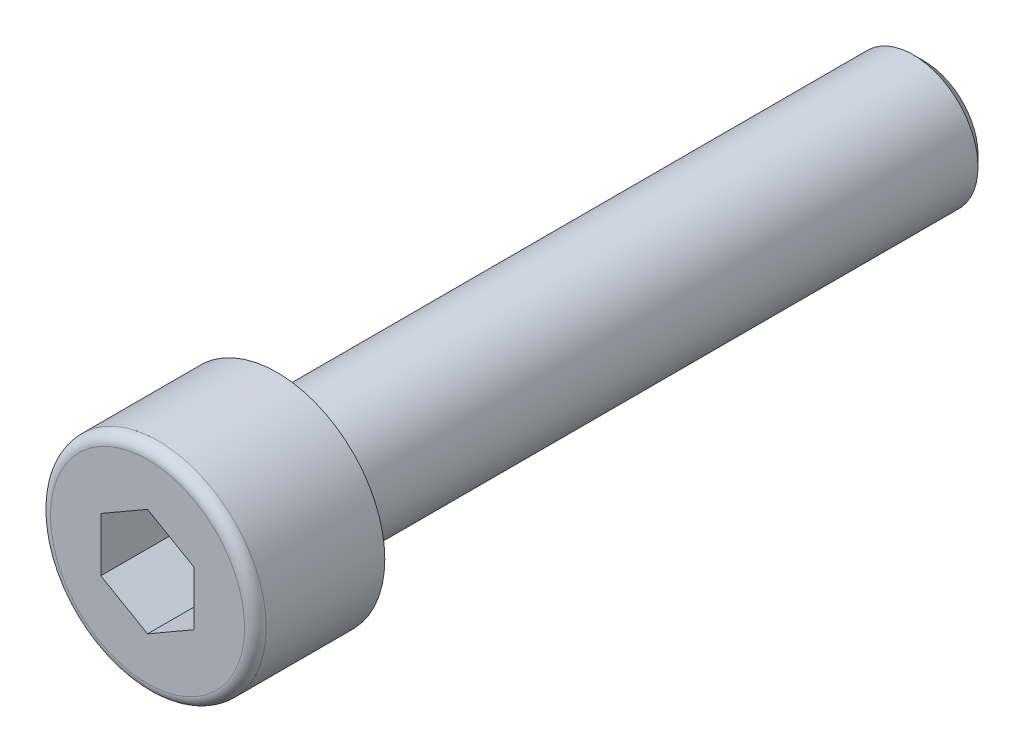
ISO-10303-21;
HEADER;
FILE_DESCRIPTION(('STEP AP214'),'2;1');
FILE_NAME('part.step','',(''),(''),'','','');
FILE_SCHEMA(('AUTOMOTIVE_DESIGN { 1 0 10303 214 1 1 1 1 }'));
ENDSEC;
DATA;
#1=APPLICATION_CONTEXT('core data for automotive mechanical design processes');
#2=APPLICATION_PROTOCOL_DEFINITION('international standard','automotive_design',2000,#1);
#3=PRODUCT_CONTEXT('',#1,'mechanical');
#4=PRODUCT('Part','Part','',(#3));
#5=PRODUCT_RELATED_PRODUCT_CATEGORY('part','',(#4));
#6=PRODUCT_DEFINITION_FORMATION('','',#4);
#7=PRODUCT_DEFINITION_CONTEXT('part definition',#1,'design');
#8=PRODUCT_DEFINITION('design','',#6,#7);
#9=PRODUCT_DEFINITION_SHAPE('','',#8);
#10=(LENGTH_UNIT() NAMED_UNIT(*) SI_UNIT(.MILLI.,.METRE.));
#11=(NAMED_UNIT(*) PLANE_ANGLE_UNIT() SI_UNIT($,.RADIAN.));
#12=(NAMED_UNIT(*) SI_UNIT($,.STERADIAN.) SOLID_ANGLE_UNIT());
#13=UNCERTAINTY_MEASURE_WITH_UNIT(LENGTH_MEASURE(1.E-05),#10,'distance_accuracy_value','');
#14=(GEOMETRIC_REPRESENTATION_CONTEXT(3) GLOBAL_UNCERTAINTY_ASSIGNED_CONTEXT((#13)) GLOBAL_UNIT_ASSIGNED_CONTEXT((#10,
#11,#12)) REPRESENTATION_CONTEXT('',''));
#15=CARTESIAN_POINT('',(0.,0.,0.));
#16=DIRECTION('',(0.,0.,1.));
#17=DIRECTION('',(1.,0.,0.));
#18=AXIS2_PLACEMENT_3D('',#15,#16,#17);
#19=CARTESIAN_POINT('',(0.,0.,30.));
#20=DIRECTION('',(0.,0.,-1.));
#21=DIRECTION('',(-1.,0.,0.));
#22=AXIS2_PLACEMENT_3D('',#19,#20,#21);
#23=CYLINDRICAL_SURFACE('',#22,3.);
#24=CARTESIAN_POINT('',(0.,0.,0.500000000000007));
#25=DIRECTION('',(0.,0.,1.));
#26=DIRECTION('',(1.,0.,0.));
#27=AXIS2_PLACEMENT_3D('',#24,#25,#26);
#28=CIRCLE('',#27,3.);
#29=CARTESIAN_POINT('',(3.,0.,0.500000000000007));
#30=VERTEX_POINT('',#29);
#31=EDGE_CURVE('E42',#30,#30,#28,.T.);
#32=ORIENTED_EDGE('',*,*,#31,.T.);
#33=EDGE_LOOP('',(#32));
#34=FACE_BOUND('',#33,.T.);
#35=CARTESIAN_POINT('',(0.,0.,30.));
#36=DIRECTION('',(0.,0.,1.));
#37=DIRECTION('',(1.,0.,0.));
#38=AXIS2_PLACEMENT_3D('',#35,#36,#37);
#39=CIRCLE('',#38,3.);
#40=CARTESIAN_POINT('',(3.,0.,30.));
#41=VERTEX_POINT('',#40);
#42=EDGE_CURVE('E145',#41,#41,#39,.T.);
#43=ORIENTED_EDGE('',*,*,#42,.F.);
#44=EDGE_LOOP('',(#43));
#45=FACE_BOUND('',#44,.T.);
#46=ADVANCED_FACE('F35',(#34,#45),#23,.T.);
#47=CARTESIAN_POINT('',(0.,0.,0.));
#48=DIRECTION('',(0.,0.,1.));
#49=DIRECTION('',(1.,0.,0.));
#50=AXIS2_PLACEMENT_3D('',#47,#48,#49);
#51=PLANE('',#50);
#52=CARTESIAN_POINT('',(0.,0.,0.));
#53=DIRECTION('',(0.,0.,1.));
#54=DIRECTION('',(1.,0.,0.));
#55=AXIS2_PLACEMENT_3D('',#52,#53,#54);
#56=CIRCLE('',#55,2.5);
#57=CARTESIAN_POINT('',(2.5,0.,0.));
#58=VERTEX_POINT('',#57);
#59=EDGE_CURVE('E11',#58,#58,#56,.F.);
#60=ORIENTED_EDGE('',*,*,#59,.T.);
#61=EDGE_LOOP('',(#60));
#62=FACE_BOUND('',#61,.T.);
#63=ADVANCED_FACE('F171',(#62),#51,.F.);
#64=CARTESIAN_POINT('',(0.,0.,30.));
#65=DIRECTION('',(0.,0.,1.));
#66=DIRECTION('',(1.,0.,0.));
#67=AXIS2_PLACEMENT_3D('',#64,#65,#66);
#68=PLANE('',#67);
#69=CARTESIAN_POINT('',(0.,0.,30.));
#70=DIRECTION('',(0.,0.,1.));
#71=DIRECTION('',(1.,0.,0.));
#72=AXIS2_PLACEMENT_3D('',#69,#70,#71);
#73=CIRCLE('',#72,5.);
#74=CARTESIAN_POINT('',(5.,0.,30.));
#75=VERTEX_POINT('',#74);
#76=EDGE_CURVE('E136',#75,#75,#73,.T.);
#77=ORIENTED_EDGE('',*,*,#76,.F.);
#78=EDGE_LOOP('',(#77));
#79=FACE_BOUND('',#78,.T.);
#80=ORIENTED_EDGE('',*,*,#42,.T.);
#81=EDGE_LOOP('',(#80));
#82=FACE_BOUND('',#81,.T.);
#83=ADVANCED_FACE('F175',(#79,#82),#68,.F.);
#84=CARTESIAN_POINT('',(0.,0.,36.));
#85=DIRECTION('',(0.,0.,-1.));
#86=DIRECTION('',(-1.,0.,0.));
#87=AXIS2_PLACEMENT_3D('',#84,#85,#86);
#88=CYLINDRICAL_SURFACE('',#87,5.);
#89=CARTESIAN_POINT('',(0.,0.,35.5));
#90=DIRECTION('',(0.,0.,1.));
#91=DIRECTION('',(1.,0.,0.));
#92=AXIS2_PLACEMENT_3D('',#89,#90,#91);
#93=CIRCLE('',#92,5.);
#94=CARTESIAN_POINT('',(5.,0.,35.5));
#95=VERTEX_POINT('',#94);
#96=EDGE_CURVE('E151',#95,#95,#93,.F.);
#97=ORIENTED_EDGE('',*,*,#96,.T.);
#98=EDGE_LOOP('',(#97));
#99=FACE_BOUND('',#98,.T.);
#100=ORIENTED_EDGE('',*,*,#76,.T.);
#101=EDGE_LOOP('',(#100));
#102=FACE_BOUND('',#101,.T.);
#103=ADVANCED_FACE('F180',(#99,#102),#88,.T.);
#104=CARTESIAN_POINT('',(0.,0.,36.));
#105=DIRECTION('',(0.,0.,1.));
#106=DIRECTION('',(1.,0.,0.));
#107=AXIS2_PLACEMENT_3D('',#104,#105,#106);
#108=PLANE('',#107);
#109=CARTESIAN_POINT('',(0.,0.,36.));
#110=DIRECTION('',(0.,0.,1.));
#111=DIRECTION('',(1.,0.,0.));
#112=AXIS2_PLACEMENT_3D('',#109,#110,#111);
#113=CIRCLE('',#112,4.5);
#114=CARTESIAN_POINT('',(4.5,0.,36.));
#115=VERTEX_POINT('',#114);
#116=EDGE_CURVE('E148',#115,#115,#113,.T.);
#117=ORIENTED_EDGE('',*,*,#116,.T.);
#118=EDGE_LOOP('',(#117));
#119=FACE_BOUND('',#118,.T.);
#120=DIRECTION('',(-0.866025403784439,0.5,0.));
#121=VECTOR('',#120,1.);
#122=CARTESIAN_POINT('',(2.1650635094611,1.25,36.));
#123=LINE('',#122,#121);
#124=CARTESIAN_POINT('',(2.1650635094611,1.25,36.));
#125=VERTEX_POINT('',#124);
#126=CARTESIAN_POINT('',(0.,2.5,36.));
#127=VERTEX_POINT('',#126);
#128=EDGE_CURVE('E49',#125,#127,#123,.T.);
#129=ORIENTED_EDGE('',*,*,#128,.F.);
#130=DIRECTION('',(0.,1.,0.));
#131=VECTOR('',#130,1.);
#132=CARTESIAN_POINT('',(2.1650635094611,-1.25,36.));
#133=LINE('',#132,#131);
#134=CARTESIAN_POINT('',(2.1650635094611,-1.25,36.));
#135=VERTEX_POINT('',#134);
#136=EDGE_CURVE('E118',#135,#125,#133,.T.);
#137=ORIENTED_EDGE('',*,*,#136,.F.);
#138=DIRECTION('',(0.866025403784439,0.5,0.));
#139=VECTOR('',#138,1.);
#140=CARTESIAN_POINT('',(0.,-2.5,36.));
#141=LINE('',#140,#139);
#142=CARTESIAN_POINT('',(0.,-2.5,36.));
#143=VERTEX_POINT('',#142);
#144=EDGE_CURVE('E112',#143,#135,#141,.T.);
#145=ORIENTED_EDGE('',*,*,#144,.F.);
#146=DIRECTION('',(0.866025403784439,-0.5,0.));
#147=VECTOR('',#146,1.);
#148=CARTESIAN_POINT('',(-2.1650635094611,-1.25,36.));
#149=LINE('',#148,#147);
#150=CARTESIAN_POINT('',(-2.1650635094611,-1.25,36.));
#151=VERTEX_POINT('',#150);
#152=EDGE_CURVE('E110',#151,#143,#149,.T.);
#153=ORIENTED_EDGE('',*,*,#152,.F.);
#154=DIRECTION('',(0.,-1.,0.));
#155=VECTOR('',#154,1.);
#156=CARTESIAN_POINT('',(-2.1650635094611,1.25,36.));
#157=LINE('',#156,#155);
#158=CARTESIAN_POINT('',(-2.1650635094611,1.25,36.));
#159=VERTEX_POINT('',#158);
#160=EDGE_CURVE('E92',#159,#151,#157,.T.);
#161=ORIENTED_EDGE('',*,*,#160,.F.);
#162=DIRECTION('',(-0.866025403784439,-0.5,0.));
#163=VECTOR('',#162,1.);
#164=CARTESIAN_POINT('',(0.,2.5,36.));
#165=LINE('',#164,#163);
#166=EDGE_CURVE('E103',#127,#159,#165,.T.);
#167=ORIENTED_EDGE('',*,*,#166,.F.);
#168=EDGE_LOOP('',(#129,#137,#145,#153,#161,#167));
#169=FACE_BOUND('',#168,.T.);
#170=ADVANCED_FACE('F107',(#119,#169),#108,.T.);
#171=CARTESIAN_POINT('',(2.1650635094611,1.25,32.5));
#172=DIRECTION('',(0.5,0.866025403784439,0.));
#173=DIRECTION('',(-0.866025403784439,0.5,0.));
#174=AXIS2_PLACEMENT_3D('',#171,#172,#173);
#175=PLANE('',#174);
#176=ORIENTED_EDGE('',*,*,#128,.T.);
#177=DIRECTION('',(0.,0.,1.));
#178=VECTOR('',#177,1.);
#179=CARTESIAN_POINT('',(0.,2.5,32.5));
#180=LINE('',#179,#178);
#181=CARTESIAN_POINT('',(0.,2.5,32.5));
#182=VERTEX_POINT('',#181);
#183=EDGE_CURVE('E100',#182,#127,#180,.T.);
#184=ORIENTED_EDGE('',*,*,#183,.F.);
#185=DIRECTION('',(-0.866025403784439,0.5,0.));
#186=VECTOR('',#185,1.);
#187=CARTESIAN_POINT('',(2.1650635094611,1.25,32.5));
#188=LINE('',#187,#186);
#189=CARTESIAN_POINT('',(2.1650635094611,1.25,32.5));
#190=VERTEX_POINT('',#189);
#191=EDGE_CURVE('E120',#190,#182,#188,.T.);
#192=ORIENTED_EDGE('',*,*,#191,.F.);
#193=DIRECTION('',(0.,0.,1.));
#194=VECTOR('',#193,1.);
#195=CARTESIAN_POINT('',(2.1650635094611,1.25,32.5));
#196=LINE('',#195,#194);
#197=EDGE_CURVE('E56',#190,#125,#196,.T.);
#198=ORIENTED_EDGE('',*,*,#197,.T.);
#199=EDGE_LOOP('',(#176,#184,#192,#198));
#200=FACE_BOUND('',#199,.T.);
#201=ADVANCED_FACE('F188',(#200),#175,.F.);
#202=CARTESIAN_POINT('',(2.1650635094611,-1.25,32.5));
#203=DIRECTION('',(1.,0.,0.));
#204=DIRECTION('',(0.,1.,0.));
#205=AXIS2_PLACEMENT_3D('',#202,#203,#204);
#206=PLANE('',#205);
#207=ORIENTED_EDGE('',*,*,#136,.T.);
#208=ORIENTED_EDGE('',*,*,#197,.F.);
#209=DIRECTION('',(0.,1.,0.));
#210=VECTOR('',#209,1.);
#211=CARTESIAN_POINT('',(2.1650635094611,-1.25,32.5));
#212=LINE('',#211,#210);
#213=CARTESIAN_POINT('',(2.1650635094611,-1.25,32.5));
#214=VERTEX_POINT('',#213);
#215=EDGE_CURVE('E132',#214,#190,#212,.T.);
#216=ORIENTED_EDGE('',*,*,#215,.F.);
#217=DIRECTION('',(0.,0.,1.));
#218=VECTOR('',#217,1.);
#219=CARTESIAN_POINT('',(2.1650635094611,-1.25,32.5));
#220=LINE('',#219,#218);
#221=EDGE_CURVE('E137',#214,#135,#220,.T.);
#222=ORIENTED_EDGE('',*,*,#221,.T.);
#223=EDGE_LOOP('',(#207,#208,#216,#222));
#224=FACE_BOUND('',#223,.T.);
#225=ADVANCED_FACE('F193',(#224),#206,.F.);
#226=CARTESIAN_POINT('',(0.,-2.5,32.5));
#227=DIRECTION('',(0.5,-0.866025403784439,0.));
#228=DIRECTION('',(0.866025403784439,0.5,0.));
#229=AXIS2_PLACEMENT_3D('',#226,#227,#228);
#230=PLANE('',#229);
#231=ORIENTED_EDGE('',*,*,#144,.T.);
#232=ORIENTED_EDGE('',*,*,#221,.F.);
#233=DIRECTION('',(0.866025403784439,0.5,0.));
#234=VECTOR('',#233,1.);
#235=CARTESIAN_POINT('',(0.,-2.5,32.5));
#236=LINE('',#235,#234);
#237=CARTESIAN_POINT('',(0.,-2.5,32.5));
#238=VERTEX_POINT('',#237);
#239=EDGE_CURVE('E129',#238,#214,#236,.T.);
#240=ORIENTED_EDGE('',*,*,#239,.F.);
#241=DIRECTION('',(0.,0.,1.));
#242=VECTOR('',#241,1.);
#243=CARTESIAN_POINT('',(0.,-2.5,32.5));
#244=LINE('',#243,#242);
#245=EDGE_CURVE('E139',#238,#143,#244,.T.);
#246=ORIENTED_EDGE('',*,*,#245,.T.);
#247=EDGE_LOOP('',(#231,#232,#240,#246));
#248=FACE_BOUND('',#247,.T.);
#249=ADVANCED_FACE('F201',(#248),#230,.F.);
#250=CARTESIAN_POINT('',(-2.1650635094611,-1.25,32.5));
#251=DIRECTION('',(-0.5,-0.866025403784439,0.));
#252=DIRECTION('',(0.866025403784439,-0.5,0.));
#253=AXIS2_PLACEMENT_3D('',#250,#251,#252);
#254=PLANE('',#253);
#255=ORIENTED_EDGE('',*,*,#152,.T.);
#256=ORIENTED_EDGE('',*,*,#245,.F.);
#257=DIRECTION('',(0.866025403784439,-0.5,0.));
#258=VECTOR('',#257,1.);
#259=CARTESIAN_POINT('',(-2.1650635094611,-1.25,32.5));
#260=LINE('',#259,#258);
#261=CARTESIAN_POINT('',(-2.1650635094611,-1.25,32.5));
#262=VERTEX_POINT('',#261);
#263=EDGE_CURVE('E126',#262,#238,#260,.T.);
#264=ORIENTED_EDGE('',*,*,#263,.F.);
#265=DIRECTION('',(0.,0.,1.));
#266=VECTOR('',#265,1.);
#267=CARTESIAN_POINT('',(-2.1650635094611,-1.25,32.5));
#268=LINE('',#267,#266);
#269=EDGE_CURVE('E99',#262,#151,#268,.T.);
#270=ORIENTED_EDGE('',*,*,#269,.T.);
#271=EDGE_LOOP('',(#255,#256,#264,#270));
#272=FACE_BOUND('',#271,.T.);
#273=ADVANCED_FACE('F198',(#272),#254,.F.);
#274=CARTESIAN_POINT('',(-2.1650635094611,1.25,32.5));
#275=DIRECTION('',(-1.,0.,0.));
#276=DIRECTION('',(0.,-1.,0.));
#277=AXIS2_PLACEMENT_3D('',#274,#275,#276);
#278=PLANE('',#277);
#279=ORIENTED_EDGE('',*,*,#160,.T.);
#280=ORIENTED_EDGE('',*,*,#269,.F.);
#281=DIRECTION('',(0.,-1.,0.));
#282=VECTOR('',#281,1.);
#283=CARTESIAN_POINT('',(-2.1650635094611,1.25,32.5));
#284=LINE('',#283,#282);
#285=CARTESIAN_POINT('',(-2.1650635094611,1.25,32.5));
#286=VERTEX_POINT('',#285);
#287=EDGE_CURVE('E95',#286,#262,#284,.T.);
#288=ORIENTED_EDGE('',*,*,#287,.F.);
#289=DIRECTION('',(0.,0.,1.));
#290=VECTOR('',#289,1.);
#291=CARTESIAN_POINT('',(-2.1650635094611,1.25,32.5));
#292=LINE('',#291,#290);
#293=EDGE_CURVE('E88',#286,#159,#292,.T.);
#294=ORIENTED_EDGE('',*,*,#293,.T.);
#295=EDGE_LOOP('',(#279,#280,#288,#294));
#296=FACE_BOUND('',#295,.T.);
#297=ADVANCED_FACE('F90',(#296),#278,.F.);
#298=CARTESIAN_POINT('',(0.,2.5,32.5));
#299=DIRECTION('',(-0.5,0.866025403784439,0.));
#300=DIRECTION('',(-0.866025403784439,-0.5,0.));
#301=AXIS2_PLACEMENT_3D('',#298,#299,#300);
#302=PLANE('',#301);
#303=ORIENTED_EDGE('',*,*,#166,.T.);
#304=ORIENTED_EDGE('',*,*,#293,.F.);
#305=DIRECTION('',(-0.866025403784439,-0.5,0.));
#306=VECTOR('',#305,1.);
#307=CARTESIAN_POINT('',(0.,2.5,32.5));
#308=LINE('',#307,#306);
#309=EDGE_CURVE('E123',#182,#286,#308,.T.);
#310=ORIENTED_EDGE('',*,*,#309,.F.);
#311=ORIENTED_EDGE('',*,*,#183,.T.);
#312=EDGE_LOOP('',(#303,#304,#310,#311));
#313=FACE_BOUND('',#312,.T.);
#314=ADVANCED_FACE('F104',(#313),#302,.F.);
#315=CARTESIAN_POINT('',(2.1650635094611,1.25,32.5));
#316=DIRECTION('',(0.,0.,-1.));
#317=DIRECTION('',(-1.,0.,0.));
#318=AXIS2_PLACEMENT_3D('',#315,#316,#317);
#319=PLANE('',#318);
#320=ORIENTED_EDGE('',*,*,#191,.T.);
#321=ORIENTED_EDGE('',*,*,#309,.T.);
#322=ORIENTED_EDGE('',*,*,#287,.T.);
#323=ORIENTED_EDGE('',*,*,#263,.T.);
#324=ORIENTED_EDGE('',*,*,#239,.T.);
#325=ORIENTED_EDGE('',*,*,#215,.T.);
#326=EDGE_LOOP('',(#320,#321,#322,#323,#324,#325));
#327=FACE_BOUND('',#326,.T.);
#328=ADVANCED_FACE('F166',(#327),#319,.F.);
#329=CARTESIAN_POINT('',(0.,0.,35.5));
#330=DIRECTION('',(0.,0.,1.));
#331=DIRECTION('',(1.,0.,0.));
#332=AXIS2_PLACEMENT_3D('',#329,#330,#331);
#333=TOROIDAL_SURFACE('',#332,4.5,0.5);
#334=ORIENTED_EDGE('',*,*,#96,.F.);
#335=EDGE_LOOP('',(#334));
#336=FACE_BOUND('',#335,.T.);
#337=ORIENTED_EDGE('',*,*,#116,.F.);
#338=EDGE_LOOP('',(#337));
#339=FACE_BOUND('',#338,.T.);
#340=ADVANCED_FACE('F160',(#336,#339),#333,.T.);
#341=CARTESIAN_POINT('',(0.,0.,0.500000000000007));
#342=DIRECTION('',(0.,0.,1.));
#343=DIRECTION('',(1.,0.,0.));
#344=AXIS2_PLACEMENT_3D('',#341,#342,#343);
#345=CONICAL_SURFACE('',#344,3.,0.785398163397445);
#346=ORIENTED_EDGE('',*,*,#59,.F.);
#347=EDGE_LOOP('',(#346));
#348=FACE_BOUND('',#347,.T.);
#349=ORIENTED_EDGE('',*,*,#31,.F.);
#350=EDGE_LOOP('',(#349));
#351=FACE_BOUND('',#350,.T.);
#352=ADVANCED_FACE('F158',(#348,#351),#345,.T.);
#353=CLOSED_SHELL('',(#46,#63,#83,#103,#170,#201,#225,#249,#273,#297,#314,#328,#340,#352));
#354=MANIFOLD_SOLID_BREP('B2',#353);
#355=ADVANCED_BREP_SHAPE_REPRESENTATION('',(#18,#354),#14);
#356=SHAPE_DEFINITION_REPRESENTATION(#9,#355);
ENDSEC;
END-ISO-10303-21;
